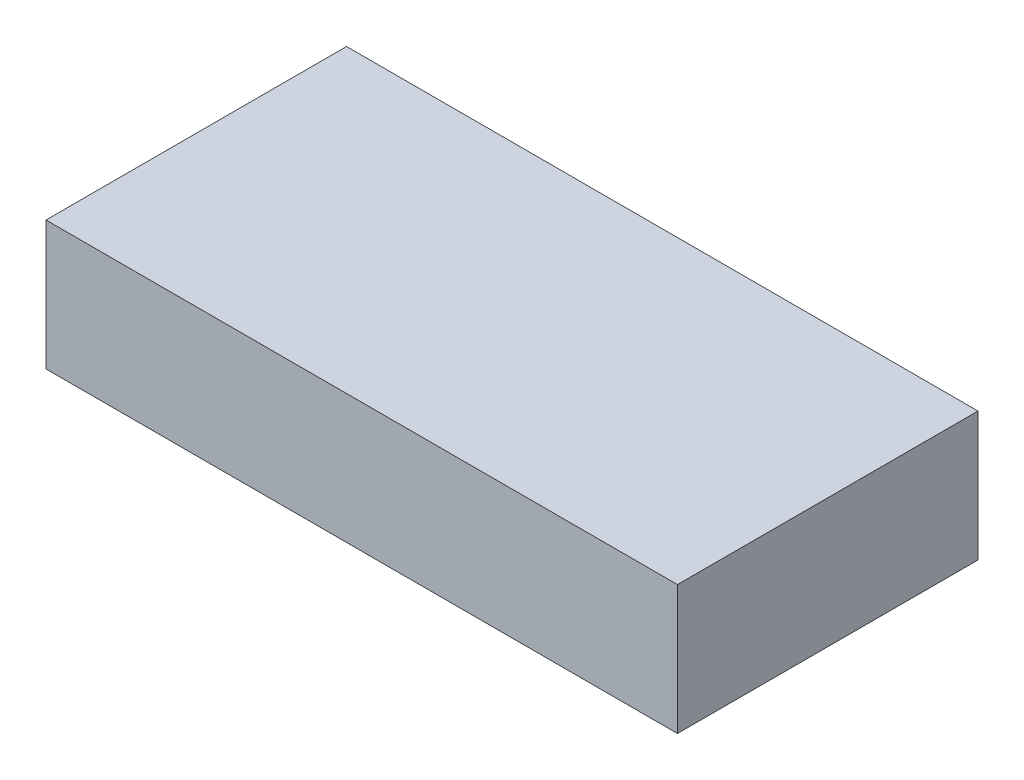
ISO-10303-21;
HEADER;
FILE_DESCRIPTION(('STEP AP214'),'2;1');
FILE_NAME('part.step','',(''),(''),'','','');
FILE_SCHEMA(('AUTOMOTIVE_DESIGN { 1 0 10303 214 1 1 1 1 }'));
ENDSEC;
DATA;
#1=APPLICATION_CONTEXT('core data for automotive mechanical design processes');
#2=APPLICATION_PROTOCOL_DEFINITION('international standard','automotive_design',2000,#1);
#3=PRODUCT_CONTEXT('',#1,'mechanical');
#4=PRODUCT('Part','Part','',(#3));
#5=PRODUCT_RELATED_PRODUCT_CATEGORY('part','',(#4));
#6=PRODUCT_DEFINITION_FORMATION('','',#4);
#7=PRODUCT_DEFINITION_CONTEXT('part definition',#1,'design');
#8=PRODUCT_DEFINITION('design','',#6,#7);
#9=PRODUCT_DEFINITION_SHAPE('','',#8);
#10=(LENGTH_UNIT() NAMED_UNIT(*) SI_UNIT(.MILLI.,.METRE.));
#11=(NAMED_UNIT(*) PLANE_ANGLE_UNIT() SI_UNIT($,.RADIAN.));
#12=(NAMED_UNIT(*) SI_UNIT($,.STERADIAN.) SOLID_ANGLE_UNIT());
#13=UNCERTAINTY_MEASURE_WITH_UNIT(LENGTH_MEASURE(1.E-05),#10,'distance_accuracy_value','');
#14=(GEOMETRIC_REPRESENTATION_CONTEXT(3) GLOBAL_UNCERTAINTY_ASSIGNED_CONTEXT((#13)) GLOBAL_UNIT_ASSIGNED_CONTEXT((#10,
#11,#12)) REPRESENTATION_CONTEXT('',''));
#15=CARTESIAN_POINT('',(0.,0.,0.));
#16=DIRECTION('',(0.,0.,1.));
#17=DIRECTION('',(1.,0.,0.));
#18=AXIS2_PLACEMENT_3D('',#15,#16,#17);
#19=CARTESIAN_POINT('',(-48.9536088049231,20.,0.));
#20=DIRECTION('',(-1.,0.,0.));
#21=DIRECTION('',(0.,0.,1.));
#22=AXIS2_PLACEMENT_3D('',#19,#20,#21);
#23=PLANE('',#22);
#24=DIRECTION('',(0.,-1.,0.));
#25=VECTOR('',#24,1.);
#26=CARTESIAN_POINT('',(-48.9536088049231,0.,-17.955));
#27=LINE('',#26,#25);
#28=CARTESIAN_POINT('',(-48.9536088049231,14.55,-17.955));
#29=VERTEX_POINT('',#28);
#30=CARTESIAN_POINT('',(-48.9536088049231,4.45,-17.955));
#31=VERTEX_POINT('',#30);
#32=EDGE_CURVE('E176',#29,#31,#27,.T.);
#33=ORIENTED_EDGE('',*,*,#32,.F.);
#34=DIRECTION('',(0.,0.,-1.));
#35=VECTOR('',#34,1.);
#36=CARTESIAN_POINT('',(-48.9536088049231,14.55,0.));
#37=LINE('',#36,#35);
#38=CARTESIAN_POINT('',(-48.9536088049231,14.55,17.955));
#39=VERTEX_POINT('',#38);
#40=EDGE_CURVE('E141',#39,#29,#37,.T.);
#41=ORIENTED_EDGE('',*,*,#40,.F.);
#42=DIRECTION('',(0.,-1.,0.));
#43=VECTOR('',#42,1.);
#44=CARTESIAN_POINT('',(-48.9536088049231,0.,17.955));
#45=LINE('',#44,#43);
#46=CARTESIAN_POINT('',(-48.9536088049231,4.45000000000001,17.955));
#47=VERTEX_POINT('',#46);
#48=EDGE_CURVE('E148',#39,#47,#45,.T.);
#49=ORIENTED_EDGE('',*,*,#48,.T.);
#50=DIRECTION('',(0.,0.,1.));
#51=VECTOR('',#50,1.);
#52=CARTESIAN_POINT('',(-48.9536088049231,4.45000000000001,0.));
#53=LINE('',#52,#51);
#54=CARTESIAN_POINT('',(-48.9536088049231,4.45000000000001,14.105));
#55=VERTEX_POINT('',#54);
#56=EDGE_CURVE('E156',#55,#47,#53,.T.);
#57=ORIENTED_EDGE('',*,*,#56,.F.);
#58=DIRECTION('',(0.,-1.,0.));
#59=VECTOR('',#58,1.);
#60=CARTESIAN_POINT('',(-48.9536088049231,0.,14.105));
#61=LINE('',#60,#59);
#62=CARTESIAN_POINT('',(-48.9536088049231,2.45000000000002,14.105));
#63=VERTEX_POINT('',#62);
#64=EDGE_CURVE('E161',#55,#63,#61,.T.);
#65=ORIENTED_EDGE('',*,*,#64,.T.);
#66=DIRECTION('',(0.,0.,1.));
#67=VECTOR('',#66,1.);
#68=CARTESIAN_POINT('',(-48.9536088049231,2.45000000000001,0.));
#69=LINE('',#68,#67);
#70=CARTESIAN_POINT('',(-48.9536088049231,2.45000000000001,-14.105));
#71=VERTEX_POINT('',#70);
#72=EDGE_CURVE('E185',#71,#63,#69,.T.);
#73=ORIENTED_EDGE('',*,*,#72,.F.);
#74=DIRECTION('',(0.,-1.,0.));
#75=VECTOR('',#74,1.);
#76=CARTESIAN_POINT('',(-48.9536088049231,0.,-14.105));
#77=LINE('',#76,#75);
#78=CARTESIAN_POINT('',(-48.9536088049231,4.45000000000001,-14.105));
#79=VERTEX_POINT('',#78);
#80=EDGE_CURVE('E182',#79,#71,#77,.T.);
#81=ORIENTED_EDGE('',*,*,#80,.F.);
#82=DIRECTION('',(0.,0.,1.));
#83=VECTOR('',#82,1.);
#84=CARTESIAN_POINT('',(-48.9536088049231,4.45000000000001,0.));
#85=LINE('',#84,#83);
#86=EDGE_CURVE('E179',#31,#79,#85,.T.);
#87=ORIENTED_EDGE('',*,*,#86,.F.);
#88=EDGE_LOOP('',(#33,#41,#49,#57,#65,#73,#81,#87));
#89=FACE_BOUND('',#88,.T.);
#90=DIRECTION('',(0.,0.,-1.));
#91=VECTOR('',#90,1.);
#92=CARTESIAN_POINT('',(-48.9536088049231,0.,0.));
#93=LINE('',#92,#91);
#94=CARTESIAN_POINT('',(-48.9536088049231,0.,23.3003819542282));
#95=VERTEX_POINT('',#94);
#96=CARTESIAN_POINT('',(-48.9536088049231,0.,-23.3003819542283));
#97=VERTEX_POINT('',#96);
#98=EDGE_CURVE('E140',#95,#97,#93,.T.);
#99=ORIENTED_EDGE('',*,*,#98,.F.);
#100=DIRECTION('',(0.,-1.,0.));
#101=VECTOR('',#100,1.);
#102=CARTESIAN_POINT('',(-48.9536088049231,20.,23.3003819542282));
#103=LINE('',#102,#101);
#104=CARTESIAN_POINT('',(-48.9536088049231,20.,23.3003819542282));
#105=VERTEX_POINT('',#104);
#106=EDGE_CURVE('E11',#105,#95,#103,.T.);
#107=ORIENTED_EDGE('',*,*,#106,.F.);
#108=DIRECTION('',(0.,0.,-1.));
#109=VECTOR('',#108,1.);
#110=CARTESIAN_POINT('',(-48.9536088049231,20.,0.));
#111=LINE('',#110,#109);
#112=CARTESIAN_POINT('',(-48.9536088049231,20.,-23.3003819542283));
#113=VERTEX_POINT('',#112);
#114=EDGE_CURVE('E204',#105,#113,#111,.T.);
#115=ORIENTED_EDGE('',*,*,#114,.T.);
#116=DIRECTION('',(0.,-1.,0.));
#117=VECTOR('',#116,1.);
#118=CARTESIAN_POINT('',(-48.9536088049231,20.,-23.3003819542283));
#119=LINE('',#118,#117);
#120=EDGE_CURVE('E74',#113,#97,#119,.T.);
#121=ORIENTED_EDGE('',*,*,#120,.T.);
#122=EDGE_LOOP('',(#99,#107,#115,#121));
#123=FACE_BOUND('',#122,.T.);
#124=ADVANCED_FACE('F35',(#89,#123),#23,.T.);
#125=CARTESIAN_POINT('',(0.,20.,23.3003819542282));
#126=DIRECTION('',(0.,0.,1.));
#127=DIRECTION('',(1.,0.,0.));
#128=AXIS2_PLACEMENT_3D('',#125,#126,#127);
#129=PLANE('',#128);
#130=DIRECTION('',(-1.,0.,0.));
#131=VECTOR('',#130,1.);
#132=CARTESIAN_POINT('',(0.,0.,23.3003819542282));
#133=LINE('',#132,#131);
#134=CARTESIAN_POINT('',(48.9536088049231,0.,23.3003819542282));
#135=VERTEX_POINT('',#134);
#136=EDGE_CURVE('E215',#135,#95,#133,.T.);
#137=ORIENTED_EDGE('',*,*,#136,.F.);
#138=DIRECTION('',(0.,-1.,0.));
#139=VECTOR('',#138,1.);
#140=CARTESIAN_POINT('',(48.9536088049231,20.,23.3003819542282));
#141=LINE('',#140,#139);
#142=CARTESIAN_POINT('',(48.9536088049231,20.,23.3003819542282));
#143=VERTEX_POINT('',#142);
#144=EDGE_CURVE('E43',#143,#135,#141,.T.);
#145=ORIENTED_EDGE('',*,*,#144,.F.);
#146=DIRECTION('',(-1.,0.,0.));
#147=VECTOR('',#146,1.);
#148=CARTESIAN_POINT('',(0.,20.,23.3003819542282));
#149=LINE('',#148,#147);
#150=EDGE_CURVE('E206',#143,#105,#149,.T.);
#151=ORIENTED_EDGE('',*,*,#150,.T.);
#152=ORIENTED_EDGE('',*,*,#106,.T.);
#153=EDGE_LOOP('',(#137,#145,#151,#152));
#154=FACE_BOUND('',#153,.T.);
#155=ADVANCED_FACE('F230',(#154),#129,.T.);
#156=CARTESIAN_POINT('',(48.9536088049231,20.,0.));
#157=DIRECTION('',(-1.,0.,0.));
#158=DIRECTION('',(0.,0.,1.));
#159=AXIS2_PLACEMENT_3D('',#156,#157,#158);
#160=PLANE('',#159);
#161=DIRECTION('',(0.,0.,-1.));
#162=VECTOR('',#161,1.);
#163=CARTESIAN_POINT('',(48.9536088049231,0.,0.));
#164=LINE('',#163,#162);
#165=CARTESIAN_POINT('',(48.9536088049231,0.,-23.3003819542283));
#166=VERTEX_POINT('',#165);
#167=EDGE_CURVE('E67',#135,#166,#164,.T.);
#168=ORIENTED_EDGE('',*,*,#167,.T.);
#169=DIRECTION('',(0.,-1.,0.));
#170=VECTOR('',#169,1.);
#171=CARTESIAN_POINT('',(48.9536088049231,20.,-23.3003819542283));
#172=LINE('',#171,#170);
#173=CARTESIAN_POINT('',(48.9536088049231,20.,-23.3003819542283));
#174=VERTEX_POINT('',#173);
#175=EDGE_CURVE('E221',#174,#166,#172,.T.);
#176=ORIENTED_EDGE('',*,*,#175,.F.);
#177=DIRECTION('',(0.,0.,-1.));
#178=VECTOR('',#177,1.);
#179=CARTESIAN_POINT('',(48.9536088049231,20.,0.));
#180=LINE('',#179,#178);
#181=EDGE_CURVE('E210',#143,#174,#180,.T.);
#182=ORIENTED_EDGE('',*,*,#181,.F.);
#183=ORIENTED_EDGE('',*,*,#144,.T.);
#184=EDGE_LOOP('',(#168,#176,#182,#183));
#185=FACE_BOUND('',#184,.T.);
#186=ADVANCED_FACE('F223',(#185),#160,.F.);
#187=CARTESIAN_POINT('',(0.,20.,-23.3003819542283));
#188=DIRECTION('',(0.,0.,1.));
#189=DIRECTION('',(1.,0.,0.));
#190=AXIS2_PLACEMENT_3D('',#187,#188,#189);
#191=PLANE('',#190);
#192=DIRECTION('',(-1.,0.,0.));
#193=VECTOR('',#192,1.);
#194=CARTESIAN_POINT('',(0.,0.,-23.3003819542283));
#195=LINE('',#194,#193);
#196=EDGE_CURVE('E207',#166,#97,#195,.T.);
#197=ORIENTED_EDGE('',*,*,#196,.T.);
#198=ORIENTED_EDGE('',*,*,#120,.F.);
#199=DIRECTION('',(-1.,0.,0.));
#200=VECTOR('',#199,1.);
#201=CARTESIAN_POINT('',(0.,20.,-23.3003819542283));
#202=LINE('',#201,#200);
#203=EDGE_CURVE('E51',#174,#113,#202,.T.);
#204=ORIENTED_EDGE('',*,*,#203,.F.);
#205=ORIENTED_EDGE('',*,*,#175,.T.);
#206=EDGE_LOOP('',(#197,#198,#204,#205));
#207=FACE_BOUND('',#206,.T.);
#208=ADVANCED_FACE('F282',(#207),#191,.F.);
#209=CARTESIAN_POINT('',(0.,20.,0.));
#210=DIRECTION('',(0.,1.,0.));
#211=DIRECTION('',(0.,0.,1.));
#212=AXIS2_PLACEMENT_3D('',#209,#210,#211);
#213=PLANE('',#212);
#214=ORIENTED_EDGE('',*,*,#114,.F.);
#215=ORIENTED_EDGE('',*,*,#150,.F.);
#216=ORIENTED_EDGE('',*,*,#181,.T.);
#217=ORIENTED_EDGE('',*,*,#203,.T.);
#218=EDGE_LOOP('',(#214,#215,#216,#217));
#219=FACE_BOUND('',#218,.T.);
#220=ADVANCED_FACE('F279',(#219),#213,.T.);
#221=CARTESIAN_POINT('',(0.,0.,0.));
#222=DIRECTION('',(0.,1.,0.));
#223=DIRECTION('',(0.,0.,1.));
#224=AXIS2_PLACEMENT_3D('',#221,#222,#223);
#225=PLANE('',#224);
#226=ORIENTED_EDGE('',*,*,#98,.T.);
#227=ORIENTED_EDGE('',*,*,#196,.F.);
#228=ORIENTED_EDGE('',*,*,#167,.F.);
#229=ORIENTED_EDGE('',*,*,#136,.T.);
#230=EDGE_LOOP('',(#226,#227,#228,#229));
#231=FACE_BOUND('',#230,.T.);
#232=ADVANCED_FACE('F229',(#231),#225,.F.);
#233=CARTESIAN_POINT('',(41.0463911950769,14.55,0.));
#234=DIRECTION('',(0.,1.,0.));
#235=DIRECTION('',(0.,0.,1.));
#236=AXIS2_PLACEMENT_3D('',#233,#234,#235);
#237=PLANE('',#236);
#238=ORIENTED_EDGE('',*,*,#40,.T.);
#239=DIRECTION('',(-1.,0.,0.));
#240=VECTOR('',#239,1.);
#241=CARTESIAN_POINT('',(41.0463911950769,14.55,-17.955));
#242=LINE('',#241,#240);
#243=CARTESIAN_POINT('',(41.0463911950769,14.55,-17.955));
#244=VERTEX_POINT('',#243);
#245=EDGE_CURVE('E135',#244,#29,#242,.T.);
#246=ORIENTED_EDGE('',*,*,#245,.F.);
#247=DIRECTION('',(0.,0.,-1.));
#248=VECTOR('',#247,1.);
#249=CARTESIAN_POINT('',(41.0463911950769,14.55,0.));
#250=LINE('',#249,#248);
#251=CARTESIAN_POINT('',(41.0463911950769,14.55,17.955));
#252=VERTEX_POINT('',#251);
#253=EDGE_CURVE('E129',#252,#244,#250,.T.);
#254=ORIENTED_EDGE('',*,*,#253,.F.);
#255=DIRECTION('',(-1.,0.,0.));
#256=VECTOR('',#255,1.);
#257=CARTESIAN_POINT('',(41.0463911950769,14.55,17.955));
#258=LINE('',#257,#256);
#259=EDGE_CURVE('E132',#252,#39,#258,.T.);
#260=ORIENTED_EDGE('',*,*,#259,.T.);
#261=EDGE_LOOP('',(#238,#246,#254,#260));
#262=FACE_BOUND('',#261,.T.);
#263=ADVANCED_FACE('F131',(#262),#237,.F.);
#264=CARTESIAN_POINT('',(41.0463911950769,0.,0.));
#265=DIRECTION('',(-1.,0.,0.));
#266=DIRECTION('',(0.,0.,1.));
#267=AXIS2_PLACEMENT_3D('',#264,#265,#266);
#268=PLANE('',#267);
#269=ORIENTED_EDGE('',*,*,#253,.T.);
#270=DIRECTION('',(0.,-1.,0.));
#271=VECTOR('',#270,1.);
#272=CARTESIAN_POINT('',(41.0463911950769,0.,-17.955));
#273=LINE('',#272,#271);
#274=CARTESIAN_POINT('',(41.0463911950769,4.45,-17.955));
#275=VERTEX_POINT('',#274);
#276=EDGE_CURVE('E155',#244,#275,#273,.T.);
#277=ORIENTED_EDGE('',*,*,#276,.T.);
#278=DIRECTION('',(0.,0.,1.));
#279=VECTOR('',#278,1.);
#280=CARTESIAN_POINT('',(41.0463911950769,4.45000000000001,0.));
#281=LINE('',#280,#279);
#282=CARTESIAN_POINT('',(41.0463911950769,4.45000000000001,-14.105));
#283=VERTEX_POINT('',#282);
#284=EDGE_CURVE('E158',#275,#283,#281,.T.);
#285=ORIENTED_EDGE('',*,*,#284,.T.);
#286=DIRECTION('',(0.,-1.,0.));
#287=VECTOR('',#286,1.);
#288=CARTESIAN_POINT('',(41.0463911950769,0.,-14.105));
#289=LINE('',#288,#287);
#290=CARTESIAN_POINT('',(41.0463911950769,2.45000000000001,-14.105));
#291=VERTEX_POINT('',#290);
#292=EDGE_CURVE('E166',#283,#291,#289,.T.);
#293=ORIENTED_EDGE('',*,*,#292,.T.);
#294=DIRECTION('',(0.,0.,1.));
#295=VECTOR('',#294,1.);
#296=CARTESIAN_POINT('',(41.0463911950769,2.45000000000001,0.));
#297=LINE('',#296,#295);
#298=CARTESIAN_POINT('',(41.0463911950769,2.45000000000002,14.105));
#299=VERTEX_POINT('',#298);
#300=EDGE_CURVE('E169',#291,#299,#297,.T.);
#301=ORIENTED_EDGE('',*,*,#300,.T.);
#302=DIRECTION('',(0.,-1.,0.));
#303=VECTOR('',#302,1.);
#304=CARTESIAN_POINT('',(41.0463911950769,0.,14.105));
#305=LINE('',#304,#303);
#306=CARTESIAN_POINT('',(41.0463911950769,4.45000000000001,14.105));
#307=VERTEX_POINT('',#306);
#308=EDGE_CURVE('E172',#307,#299,#305,.T.);
#309=ORIENTED_EDGE('',*,*,#308,.F.);
#310=DIRECTION('',(0.,0.,1.));
#311=VECTOR('',#310,1.);
#312=CARTESIAN_POINT('',(41.0463911950769,4.45000000000001,0.));
#313=LINE('',#312,#311);
#314=CARTESIAN_POINT('',(41.0463911950769,4.45000000000001,17.955));
#315=VERTEX_POINT('',#314);
#316=EDGE_CURVE('E149',#307,#315,#313,.T.);
#317=ORIENTED_EDGE('',*,*,#316,.T.);
#318=DIRECTION('',(0.,-1.,0.));
#319=VECTOR('',#318,1.);
#320=CARTESIAN_POINT('',(41.0463911950769,0.,17.955));
#321=LINE('',#320,#319);
#322=EDGE_CURVE('E145',#252,#315,#321,.T.);
#323=ORIENTED_EDGE('',*,*,#322,.F.);
#324=EDGE_LOOP('',(#269,#277,#285,#293,#301,#309,#317,#323));
#325=FACE_BOUND('',#324,.T.);
#326=ADVANCED_FACE('F152',(#325),#268,.T.);
#327=CARTESIAN_POINT('',(41.0463911950769,0.,17.955));
#328=DIRECTION('',(0.,0.,-1.));
#329=DIRECTION('',(0.,1.,0.));
#330=AXIS2_PLACEMENT_3D('',#327,#328,#329);
#331=PLANE('',#330);
#332=ORIENTED_EDGE('',*,*,#48,.F.);
#333=ORIENTED_EDGE('',*,*,#259,.F.);
#334=ORIENTED_EDGE('',*,*,#322,.T.);
#335=DIRECTION('',(-1.,0.,0.));
#336=VECTOR('',#335,1.);
#337=CARTESIAN_POINT('',(41.0463911950769,4.45000000000001,17.955));
#338=LINE('',#337,#336);
#339=EDGE_CURVE('E190',#315,#47,#338,.T.);
#340=ORIENTED_EDGE('',*,*,#339,.T.);
#341=EDGE_LOOP('',(#332,#333,#334,#340));
#342=FACE_BOUND('',#341,.T.);
#343=ADVANCED_FACE('F144',(#342),#331,.T.);
#344=CARTESIAN_POINT('',(41.0463911950769,4.45000000000001,0.));
#345=DIRECTION('',(0.,-1.,0.));
#346=DIRECTION('',(0.,0.,-1.));
#347=AXIS2_PLACEMENT_3D('',#344,#345,#346);
#348=PLANE('',#347);
#349=ORIENTED_EDGE('',*,*,#56,.T.);
#350=ORIENTED_EDGE('',*,*,#339,.F.);
#351=ORIENTED_EDGE('',*,*,#316,.F.);
#352=DIRECTION('',(-1.,0.,0.));
#353=VECTOR('',#352,1.);
#354=CARTESIAN_POINT('',(41.0463911950769,4.45000000000001,14.105));
#355=LINE('',#354,#353);
#356=EDGE_CURVE('E192',#307,#55,#355,.T.);
#357=ORIENTED_EDGE('',*,*,#356,.T.);
#358=EDGE_LOOP('',(#349,#350,#351,#357));
#359=FACE_BOUND('',#358,.T.);
#360=ADVANCED_FACE('F254',(#359),#348,.F.);
#361=CARTESIAN_POINT('',(41.0463911950769,0.,14.105));
#362=DIRECTION('',(0.,0.,-1.));
#363=DIRECTION('',(0.,1.,0.));
#364=AXIS2_PLACEMENT_3D('',#361,#362,#363);
#365=PLANE('',#364);
#366=ORIENTED_EDGE('',*,*,#64,.F.);
#367=ORIENTED_EDGE('',*,*,#356,.F.);
#368=ORIENTED_EDGE('',*,*,#308,.T.);
#369=DIRECTION('',(-1.,0.,0.));
#370=VECTOR('',#369,1.);
#371=CARTESIAN_POINT('',(41.0463911950769,2.45000000000002,14.105));
#372=LINE('',#371,#370);
#373=EDGE_CURVE('E194',#299,#63,#372,.T.);
#374=ORIENTED_EDGE('',*,*,#373,.T.);
#375=EDGE_LOOP('',(#366,#367,#368,#374));
#376=FACE_BOUND('',#375,.T.);
#377=ADVANCED_FACE('F257',(#376),#365,.T.);
#378=CARTESIAN_POINT('',(41.0463911950769,2.45000000000001,0.));
#379=DIRECTION('',(0.,-1.,0.));
#380=DIRECTION('',(0.,0.,-1.));
#381=AXIS2_PLACEMENT_3D('',#378,#379,#380);
#382=PLANE('',#381);
#383=ORIENTED_EDGE('',*,*,#72,.T.);
#384=ORIENTED_EDGE('',*,*,#373,.F.);
#385=ORIENTED_EDGE('',*,*,#300,.F.);
#386=DIRECTION('',(-1.,0.,0.));
#387=VECTOR('',#386,1.);
#388=CARTESIAN_POINT('',(41.0463911950769,2.45000000000001,-14.105));
#389=LINE('',#388,#387);
#390=EDGE_CURVE('E196',#291,#71,#389,.T.);
#391=ORIENTED_EDGE('',*,*,#390,.T.);
#392=EDGE_LOOP('',(#383,#384,#385,#391));
#393=FACE_BOUND('',#392,.T.);
#394=ADVANCED_FACE('F251',(#393),#382,.F.);
#395=CARTESIAN_POINT('',(41.0463911950769,0.,-14.105));
#396=DIRECTION('',(0.,0.,-1.));
#397=DIRECTION('',(0.,1.,0.));
#398=AXIS2_PLACEMENT_3D('',#395,#396,#397);
#399=PLANE('',#398);
#400=ORIENTED_EDGE('',*,*,#80,.T.);
#401=ORIENTED_EDGE('',*,*,#390,.F.);
#402=ORIENTED_EDGE('',*,*,#292,.F.);
#403=DIRECTION('',(-1.,0.,0.));
#404=VECTOR('',#403,1.);
#405=CARTESIAN_POINT('',(41.0463911950769,4.45000000000001,-14.105));
#406=LINE('',#405,#404);
#407=EDGE_CURVE('E198',#283,#79,#406,.T.);
#408=ORIENTED_EDGE('',*,*,#407,.T.);
#409=EDGE_LOOP('',(#400,#401,#402,#408));
#410=FACE_BOUND('',#409,.T.);
#411=ADVANCED_FACE('F246',(#410),#399,.F.);
#412=CARTESIAN_POINT('',(41.0463911950769,4.45000000000001,0.));
#413=DIRECTION('',(0.,-1.,0.));
#414=DIRECTION('',(0.,0.,-1.));
#415=AXIS2_PLACEMENT_3D('',#412,#413,#414);
#416=PLANE('',#415);
#417=ORIENTED_EDGE('',*,*,#86,.T.);
#418=ORIENTED_EDGE('',*,*,#407,.F.);
#419=ORIENTED_EDGE('',*,*,#284,.F.);
#420=DIRECTION('',(-1.,0.,0.));
#421=VECTOR('',#420,1.);
#422=CARTESIAN_POINT('',(41.0463911950769,4.45,-17.955));
#423=LINE('',#422,#421);
#424=EDGE_CURVE('E200',#275,#31,#423,.T.);
#425=ORIENTED_EDGE('',*,*,#424,.T.);
#426=EDGE_LOOP('',(#417,#418,#419,#425));
#427=FACE_BOUND('',#426,.T.);
#428=ADVANCED_FACE('F244',(#427),#416,.F.);
#429=CARTESIAN_POINT('',(41.0463911950769,0.,-17.955));
#430=DIRECTION('',(0.,0.,-1.));
#431=DIRECTION('',(0.,1.,0.));
#432=AXIS2_PLACEMENT_3D('',#429,#430,#431);
#433=PLANE('',#432);
#434=ORIENTED_EDGE('',*,*,#32,.T.);
#435=ORIENTED_EDGE('',*,*,#424,.F.);
#436=ORIENTED_EDGE('',*,*,#276,.F.);
#437=ORIENTED_EDGE('',*,*,#245,.T.);
#438=EDGE_LOOP('',(#434,#435,#436,#437));
#439=FACE_BOUND('',#438,.T.);
#440=ADVANCED_FACE('F240',(#439),#433,.F.);
#441=CLOSED_SHELL('',(#124,#155,#186,#208,#220,#232,#263,#326,#343,#360,#377,#394,#411,#428,#440));
#442=MANIFOLD_SOLID_BREP('B2',#441);
#443=ADVANCED_BREP_SHAPE_REPRESENTATION('',(#18,#442),#14);
#444=SHAPE_DEFINITION_REPRESENTATION(#9,#443);
ENDSEC;
END-ISO-10303-21;
